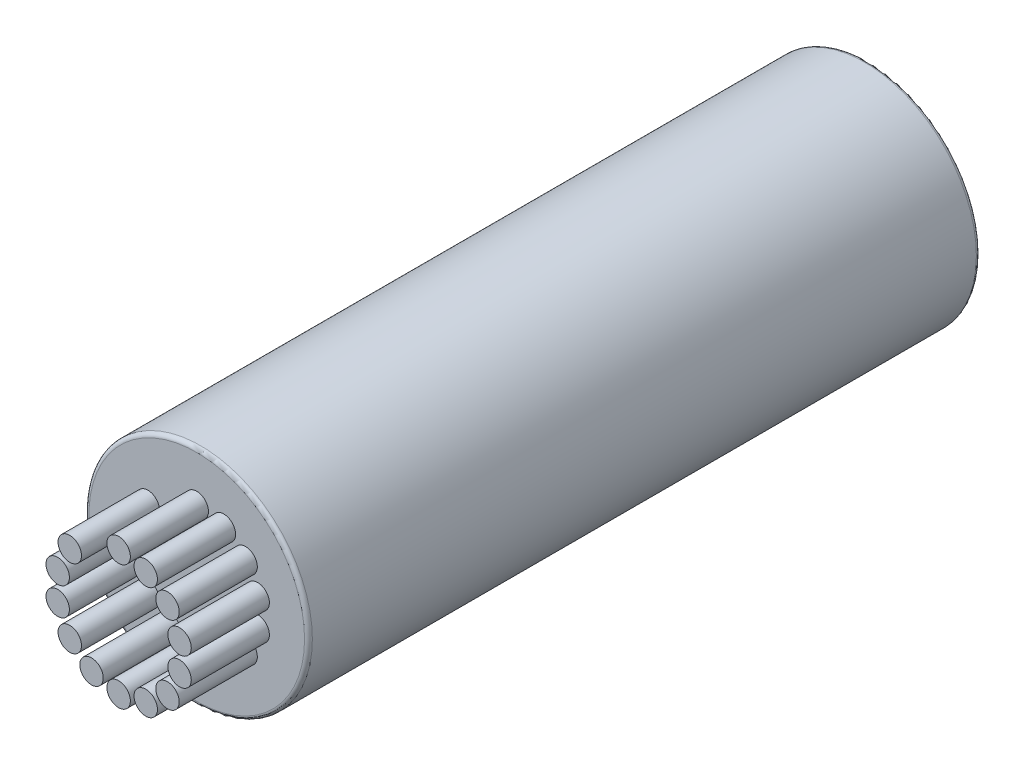
ISO-10303-21;
HEADER;
FILE_DESCRIPTION(('STEP AP214'),'2;1');
FILE_NAME('part.step','',(''),(''),'','','');
FILE_SCHEMA(('AUTOMOTIVE_DESIGN { 1 0 10303 214 1 1 1 1 }'));
ENDSEC;
DATA;
#1=APPLICATION_CONTEXT('core data for automotive mechanical design processes');
#2=APPLICATION_PROTOCOL_DEFINITION('international standard','automotive_design',2000,#1);
#3=PRODUCT_CONTEXT('',#1,'mechanical');
#4=PRODUCT('Part','Part','',(#3));
#5=PRODUCT_RELATED_PRODUCT_CATEGORY('part','',(#4));
#6=PRODUCT_DEFINITION_FORMATION('','',#4);
#7=PRODUCT_DEFINITION_CONTEXT('part definition',#1,'design');
#8=PRODUCT_DEFINITION('design','',#6,#7);
#9=PRODUCT_DEFINITION_SHAPE('','',#8);
#10=(LENGTH_UNIT() NAMED_UNIT(*) SI_UNIT(.MILLI.,.METRE.));
#11=(NAMED_UNIT(*) PLANE_ANGLE_UNIT() SI_UNIT($,.RADIAN.));
#12=(NAMED_UNIT(*) SI_UNIT($,.STERADIAN.) SOLID_ANGLE_UNIT());
#13=UNCERTAINTY_MEASURE_WITH_UNIT(LENGTH_MEASURE(1.E-05),#10,'distance_accuracy_value','');
#14=(GEOMETRIC_REPRESENTATION_CONTEXT(3) GLOBAL_UNCERTAINTY_ASSIGNED_CONTEXT((#13)) GLOBAL_UNIT_ASSIGNED_CONTEXT((#10,
#11,#12)) REPRESENTATION_CONTEXT('',''));
#15=CARTESIAN_POINT('',(0.,0.,0.));
#16=DIRECTION('',(0.,0.,1.));
#17=DIRECTION('',(1.,0.,0.));
#18=AXIS2_PLACEMENT_3D('',#15,#16,#17);
#19=CARTESIAN_POINT('',(0.,0.,43.));
#20=DIRECTION('',(0.,0.,-1.));
#21=DIRECTION('',(-1.,0.,0.));
#22=AXIS2_PLACEMENT_3D('',#19,#20,#21);
#23=CYLINDRICAL_SURFACE('',#22,7.15);
#24=CARTESIAN_POINT('',(0.,0.,42.75));
#25=DIRECTION('',(0.,0.,1.));
#26=DIRECTION('',(1.,0.,0.));
#27=AXIS2_PLACEMENT_3D('',#24,#25,#26);
#28=CIRCLE('',#27,7.15);
#29=CARTESIAN_POINT('',(7.15,0.,42.75));
#30=VERTEX_POINT('',#29);
#31=EDGE_CURVE('E39',#30,#30,#28,.F.);
#32=ORIENTED_EDGE('',*,*,#31,.T.);
#33=EDGE_LOOP('',(#32));
#34=FACE_BOUND('',#33,.T.);
#35=CARTESIAN_POINT('',(0.,0.,0.25));
#36=DIRECTION('',(0.,0.,1.));
#37=DIRECTION('',(1.,0.,0.));
#38=AXIS2_PLACEMENT_3D('',#35,#36,#37);
#39=CIRCLE('',#38,7.15);
#40=CARTESIAN_POINT('',(7.15,0.,0.25));
#41=VERTEX_POINT('',#40);
#42=EDGE_CURVE('E43',#41,#41,#39,.T.);
#43=ORIENTED_EDGE('',*,*,#42,.T.);
#44=EDGE_LOOP('',(#43));
#45=FACE_BOUND('',#44,.T.);
#46=ADVANCED_FACE('F32',(#34,#45),#23,.T.);
#47=CARTESIAN_POINT('',(0.,0.,43.));
#48=DIRECTION('',(0.,0.,1.));
#49=DIRECTION('',(1.,0.,0.));
#50=AXIS2_PLACEMENT_3D('',#47,#48,#49);
#51=PLANE('',#50);
#52=CARTESIAN_POINT('',(0.,0.,43.));
#53=DIRECTION('',(0.,0.,1.));
#54=DIRECTION('',(1.,0.,0.));
#55=AXIS2_PLACEMENT_3D('',#52,#53,#54);
#56=CIRCLE('',#55,6.9);
#57=CARTESIAN_POINT('',(6.9,0.,43.));
#58=VERTEX_POINT('',#57);
#59=EDGE_CURVE('E47',#58,#58,#56,.T.);
#60=ORIENTED_EDGE('',*,*,#59,.T.);
#61=EDGE_LOOP('',(#60));
#62=FACE_BOUND('',#61,.T.);
#63=CARTESIAN_POINT('',(-3.12732592987195,2.49395920743501,43.));
#64=DIRECTION('',(0.,0.,1.));
#65=DIRECTION('',(1.,0.,0.));
#66=AXIS2_PLACEMENT_3D('',#63,#64,#65);
#67=CIRCLE('',#66,0.750000000000115);
#68=CARTESIAN_POINT('',(-2.37732592987183,2.49395920743501,43.));
#69=VERTEX_POINT('',#68);
#70=EDGE_CURVE('E131',#69,#69,#67,.T.);
#71=ORIENTED_EDGE('',*,*,#70,.F.);
#72=EDGE_LOOP('',(#71));
#73=FACE_BOUND('',#72,.T.);
#74=CARTESIAN_POINT('',(-3.89971164872716,0.890083735825348,43.));
#75=DIRECTION('',(0.,0.,1.));
#76=DIRECTION('',(1.,0.,0.));
#77=AXIS2_PLACEMENT_3D('',#74,#75,#76);
#78=CIRCLE('',#77,0.750000000000158);
#79=CARTESIAN_POINT('',(-3.149711648727,0.890083735825348,43.));
#80=VERTEX_POINT('',#79);
#81=EDGE_CURVE('E125',#80,#80,#78,.T.);
#82=ORIENTED_EDGE('',*,*,#81,.F.);
#83=EDGE_LOOP('',(#82));
#84=FACE_BOUND('',#83,.T.);
#85=CARTESIAN_POINT('',(-3.8997116487272,-0.890083735825168,43.));
#86=DIRECTION('',(0.,0.,1.));
#87=DIRECTION('',(1.,0.,0.));
#88=AXIS2_PLACEMENT_3D('',#85,#86,#87);
#89=CIRCLE('',#88,0.750000000000203);
#90=CARTESIAN_POINT('',(-3.149711648727,-0.890083735825168,43.));
#91=VERTEX_POINT('',#90);
#92=EDGE_CURVE('E119',#91,#91,#89,.T.);
#93=ORIENTED_EDGE('',*,*,#92,.F.);
#94=EDGE_LOOP('',(#93));
#95=FACE_BOUND('',#94,.T.);
#96=CARTESIAN_POINT('',(-3.12732592987206,-2.49395920743486,43.));
#97=DIRECTION('',(0.,0.,1.));
#98=DIRECTION('',(1.,0.,0.));
#99=AXIS2_PLACEMENT_3D('',#96,#97,#98);
#100=CIRCLE('',#99,0.750000000000238);
#101=CARTESIAN_POINT('',(-2.37732592987182,-2.49395920743486,43.));
#102=VERTEX_POINT('',#101);
#103=EDGE_CURVE('E113',#102,#102,#100,.T.);
#104=ORIENTED_EDGE('',*,*,#103,.F.);
#105=EDGE_LOOP('',(#104));
#106=FACE_BOUND('',#105,.T.);
#107=CARTESIAN_POINT('',(-1.7355349564702,-3.60387547160964,43.));
#108=DIRECTION('',(0.,0.,1.));
#109=DIRECTION('',(1.,0.,0.));
#110=AXIS2_PLACEMENT_3D('',#107,#108,#109);
#111=CIRCLE('',#110,0.750000000000253);
#112=CARTESIAN_POINT('',(-0.985534956469948,-3.60387547160964,43.));
#113=VERTEX_POINT('',#112);
#114=EDGE_CURVE('E107',#113,#113,#111,.T.);
#115=ORIENTED_EDGE('',*,*,#114,.F.);
#116=EDGE_LOOP('',(#115));
#117=FACE_BOUND('',#116,.T.);
#118=CARTESIAN_POINT('',(0.,-4.,43.));
#119=DIRECTION('',(0.,0.,1.));
#120=DIRECTION('',(1.,0.,0.));
#121=AXIS2_PLACEMENT_3D('',#118,#119,#120);
#122=CIRCLE('',#121,0.750000000000246);
#123=CARTESIAN_POINT('',(0.750000000000268,-4.,43.));
#124=VERTEX_POINT('',#123);
#125=EDGE_CURVE('E101',#124,#124,#122,.T.);
#126=ORIENTED_EDGE('',*,*,#125,.F.);
#127=EDGE_LOOP('',(#126));
#128=FACE_BOUND('',#127,.T.);
#129=CARTESIAN_POINT('',(1.73553495647026,-3.60387547160972,43.));
#130=DIRECTION('',(0.,0.,1.));
#131=DIRECTION('',(1.,0.,0.));
#132=AXIS2_PLACEMENT_3D('',#129,#130,#131);
#133=CIRCLE('',#132,0.750000000000218);
#134=CARTESIAN_POINT('',(2.48553495647048,-3.60387547160972,43.));
#135=VERTEX_POINT('',#134);
#136=EDGE_CURVE('E95',#135,#135,#133,.T.);
#137=ORIENTED_EDGE('',*,*,#136,.F.);
#138=EDGE_LOOP('',(#137));
#139=FACE_BOUND('',#138,.T.);
#140=CARTESIAN_POINT('',(3.12732592987218,-2.49395920743501,43.));
#141=DIRECTION('',(0.,0.,1.));
#142=DIRECTION('',(1.,0.,0.));
#143=AXIS2_PLACEMENT_3D('',#140,#141,#142);
#144=CIRCLE('',#143,0.75000000000017);
#145=CARTESIAN_POINT('',(3.87732592987235,-2.49395920743501,43.));
#146=VERTEX_POINT('',#145);
#147=EDGE_CURVE('E89',#146,#146,#144,.T.);
#148=ORIENTED_EDGE('',*,*,#147,.F.);
#149=EDGE_LOOP('',(#148));
#150=FACE_BOUND('',#149,.T.);
#151=CARTESIAN_POINT('',(3.89971164872739,-0.890083735825348,43.));
#152=DIRECTION('',(0.,0.,1.));
#153=DIRECTION('',(1.,0.,0.));
#154=AXIS2_PLACEMENT_3D('',#151,#152,#153);
#155=CIRCLE('',#154,0.750000000000117);
#156=CARTESIAN_POINT('',(4.64971164872751,-0.890083735825348,43.));
#157=VERTEX_POINT('',#156);
#158=EDGE_CURVE('E83',#157,#157,#155,.T.);
#159=ORIENTED_EDGE('',*,*,#158,.F.);
#160=EDGE_LOOP('',(#159));
#161=FACE_BOUND('',#160,.T.);
#162=CARTESIAN_POINT('',(3.89971164872743,0.890083735825167,43.));
#163=DIRECTION('',(0.,0.,1.));
#164=DIRECTION('',(1.,0.,0.));
#165=AXIS2_PLACEMENT_3D('',#162,#163,#164);
#166=CIRCLE('',#165,0.750000000000064);
#167=CARTESIAN_POINT('',(4.64971164872749,0.890083735825167,43.));
#168=VERTEX_POINT('',#167);
#169=EDGE_CURVE('E77',#168,#168,#166,.T.);
#170=ORIENTED_EDGE('',*,*,#169,.F.);
#171=EDGE_LOOP('',(#170));
#172=FACE_BOUND('',#171,.T.);
#173=CARTESIAN_POINT('',(3.12732592987225,2.49395920743477,43.));
#174=DIRECTION('',(0.,0.,1.));
#175=DIRECTION('',(1.,0.,0.));
#176=AXIS2_PLACEMENT_3D('',#173,#174,#175);
#177=CIRCLE('',#176,0.75);
#178=CARTESIAN_POINT('',(3.87732592987225,2.49395920743477,43.));
#179=VERTEX_POINT('',#178);
#180=EDGE_CURVE('E71',#179,#179,#177,.T.);
#181=ORIENTED_EDGE('',*,*,#180,.F.);
#182=EDGE_LOOP('',(#181));
#183=FACE_BOUND('',#182,.T.);
#184=CARTESIAN_POINT('',(1.73553495647042,3.60387547160959,43.));
#185=DIRECTION('',(0.,0.,1.));
#186=DIRECTION('',(1.,0.,0.));
#187=AXIS2_PLACEMENT_3D('',#184,#185,#186);
#188=CIRCLE('',#187,0.75);
#189=CARTESIAN_POINT('',(2.48553495647042,3.60387547160959,43.));
#190=VERTEX_POINT('',#189);
#191=EDGE_CURVE('E65',#190,#190,#188,.T.);
#192=ORIENTED_EDGE('',*,*,#191,.F.);
#193=EDGE_LOOP('',(#192));
#194=FACE_BOUND('',#193,.T.);
#195=CARTESIAN_POINT('',(2.07662222155635E-13,4.,43.));
#196=DIRECTION('',(0.,0.,1.));
#197=DIRECTION('',(1.,0.,0.));
#198=AXIS2_PLACEMENT_3D('',#195,#196,#197);
#199=CIRCLE('',#198,0.75);
#200=CARTESIAN_POINT('',(0.750000000000208,4.,43.));
#201=VERTEX_POINT('',#200);
#202=EDGE_CURVE('E59',#201,#201,#199,.T.);
#203=ORIENTED_EDGE('',*,*,#202,.F.);
#204=EDGE_LOOP('',(#203));
#205=FACE_BOUND('',#204,.T.);
#206=ADVANCED_FACE('F146',(#62,#73,#84,#95,#106,#117,#128,#139,#150,#161,#172,#183,#194,#205),
#51,.T.);
#207=CARTESIAN_POINT('',(0.,0.,0.));
#208=DIRECTION('',(0.,0.,1.));
#209=DIRECTION('',(1.,0.,0.));
#210=AXIS2_PLACEMENT_3D('',#207,#208,#209);
#211=PLANE('',#210);
#212=CARTESIAN_POINT('',(0.,0.,0.));
#213=DIRECTION('',(0.,0.,1.));
#214=DIRECTION('',(1.,0.,0.));
#215=AXIS2_PLACEMENT_3D('',#212,#213,#214);
#216=CIRCLE('',#215,6.9);
#217=CARTESIAN_POINT('',(6.9,0.,0.));
#218=VERTEX_POINT('',#217);
#219=EDGE_CURVE('E10',#218,#218,#216,.F.);
#220=ORIENTED_EDGE('',*,*,#219,.T.);
#221=EDGE_LOOP('',(#220));
#222=FACE_BOUND('',#221,.T.);
#223=CARTESIAN_POINT('',(0.,0.,0.));
#224=DIRECTION('',(0.,0.,-1.));
#225=DIRECTION('',(-1.,0.,0.));
#226=AXIS2_PLACEMENT_3D('',#223,#224,#225);
#227=CIRCLE('',#226,5.);
#228=CARTESIAN_POINT('',(-5.,0.,0.));
#229=VERTEX_POINT('',#228);
#230=EDGE_CURVE('E53',#229,#229,#227,.T.);
#231=ORIENTED_EDGE('',*,*,#230,.F.);
#232=EDGE_LOOP('',(#231));
#233=FACE_BOUND('',#232,.T.);
#234=ADVANCED_FACE('F149',(#222,#233),#211,.F.);
#235=CARTESIAN_POINT('',(0.,0.,0.1));
#236=DIRECTION('',(0.,0.,-1.));
#237=DIRECTION('',(-1.,0.,0.));
#238=AXIS2_PLACEMENT_3D('',#235,#236,#237);
#239=CYLINDRICAL_SURFACE('',#238,5.);
#240=CARTESIAN_POINT('',(0.,0.,0.1));
#241=DIRECTION('',(0.,0.,-1.));
#242=DIRECTION('',(-1.,0.,0.));
#243=AXIS2_PLACEMENT_3D('',#240,#241,#242);
#244=CIRCLE('',#243,5.);
#245=CARTESIAN_POINT('',(-5.,0.,0.1));
#246=VERTEX_POINT('',#245);
#247=EDGE_CURVE('E52',#246,#246,#244,.T.);
#248=ORIENTED_EDGE('',*,*,#247,.F.);
#249=EDGE_LOOP('',(#248));
#250=FACE_BOUND('',#249,.T.);
#251=ORIENTED_EDGE('',*,*,#230,.T.);
#252=EDGE_LOOP('',(#251));
#253=FACE_BOUND('',#252,.T.);
#254=ADVANCED_FACE('F189',(#250,#253),#239,.F.);
#255=CARTESIAN_POINT('',(0.,0.,0.1));
#256=DIRECTION('',(0.,0.,-1.));
#257=DIRECTION('',(-1.,0.,0.));
#258=AXIS2_PLACEMENT_3D('',#255,#256,#257);
#259=PLANE('',#258);
#260=ORIENTED_EDGE('',*,*,#247,.T.);
#261=EDGE_LOOP('',(#260));
#262=FACE_BOUND('',#261,.T.);
#263=ADVANCED_FACE('F179',(#262),#259,.T.);
#264=CARTESIAN_POINT('',(2.07662222155635E-13,4.,48.));
#265=DIRECTION('',(0.,0.,-1.));
#266=DIRECTION('',(-1.,0.,0.));
#267=AXIS2_PLACEMENT_3D('',#264,#265,#266);
#268=CYLINDRICAL_SURFACE('',#267,0.75);
#269=CARTESIAN_POINT('',(2.07662222155635E-13,4.,48.));
#270=DIRECTION('',(0.,0.,1.));
#271=DIRECTION('',(1.,0.,0.));
#272=AXIS2_PLACEMENT_3D('',#269,#270,#271);
#273=CIRCLE('',#272,0.75);
#274=CARTESIAN_POINT('',(0.750000000000208,4.,48.));
#275=VERTEX_POINT('',#274);
#276=EDGE_CURVE('E56',#275,#275,#273,.T.);
#277=ORIENTED_EDGE('',*,*,#276,.F.);
#278=EDGE_LOOP('',(#277));
#279=FACE_BOUND('',#278,.T.);
#280=ORIENTED_EDGE('',*,*,#202,.T.);
#281=EDGE_LOOP('',(#280));
#282=FACE_BOUND('',#281,.T.);
#283=ADVANCED_FACE('F176',(#279,#282),#268,.T.);
#284=CARTESIAN_POINT('',(2.07662222155635E-13,4.,48.));
#285=DIRECTION('',(0.,0.,1.));
#286=DIRECTION('',(1.,0.,0.));
#287=AXIS2_PLACEMENT_3D('',#284,#285,#286);
#288=PLANE('',#287);
#289=ORIENTED_EDGE('',*,*,#276,.T.);
#290=EDGE_LOOP('',(#289));
#291=FACE_BOUND('',#290,.T.);
#292=ADVANCED_FACE('F178',(#291),#288,.T.);
#293=CARTESIAN_POINT('',(1.73553495647042,3.60387547160959,48.));
#294=DIRECTION('',(0.,0.,-1.));
#295=DIRECTION('',(-1.,0.,0.));
#296=AXIS2_PLACEMENT_3D('',#293,#294,#295);
#297=CYLINDRICAL_SURFACE('',#296,0.75);
#298=CARTESIAN_POINT('',(1.73553495647042,3.60387547160959,48.));
#299=DIRECTION('',(0.,0.,1.));
#300=DIRECTION('',(1.,0.,0.));
#301=AXIS2_PLACEMENT_3D('',#298,#299,#300);
#302=CIRCLE('',#301,0.75);
#303=CARTESIAN_POINT('',(2.48553495647042,3.60387547160959,48.));
#304=VERTEX_POINT('',#303);
#305=EDGE_CURVE('E62',#304,#304,#302,.T.);
#306=ORIENTED_EDGE('',*,*,#305,.F.);
#307=EDGE_LOOP('',(#306));
#308=FACE_BOUND('',#307,.T.);
#309=ORIENTED_EDGE('',*,*,#191,.T.);
#310=EDGE_LOOP('',(#309));
#311=FACE_BOUND('',#310,.T.);
#312=ADVANCED_FACE('F186',(#308,#311),#297,.T.);
#313=CARTESIAN_POINT('',(1.73553495647042,3.60387547160959,48.));
#314=DIRECTION('',(0.,0.,1.));
#315=DIRECTION('',(1.,0.,0.));
#316=AXIS2_PLACEMENT_3D('',#313,#314,#315);
#317=PLANE('',#316);
#318=ORIENTED_EDGE('',*,*,#305,.T.);
#319=EDGE_LOOP('',(#318));
#320=FACE_BOUND('',#319,.T.);
#321=ADVANCED_FACE('F291',(#320),#317,.T.);
#322=CARTESIAN_POINT('',(3.12732592987225,2.49395920743477,48.));
#323=DIRECTION('',(0.,0.,-1.));
#324=DIRECTION('',(-1.,0.,0.));
#325=AXIS2_PLACEMENT_3D('',#322,#323,#324);
#326=CYLINDRICAL_SURFACE('',#325,0.75);
#327=CARTESIAN_POINT('',(3.12732592987225,2.49395920743477,48.));
#328=DIRECTION('',(0.,0.,1.));
#329=DIRECTION('',(1.,0.,0.));
#330=AXIS2_PLACEMENT_3D('',#327,#328,#329);
#331=CIRCLE('',#330,0.75);
#332=CARTESIAN_POINT('',(3.87732592987225,2.49395920743477,48.));
#333=VERTEX_POINT('',#332);
#334=EDGE_CURVE('E68',#333,#333,#331,.T.);
#335=ORIENTED_EDGE('',*,*,#334,.F.);
#336=EDGE_LOOP('',(#335));
#337=FACE_BOUND('',#336,.T.);
#338=ORIENTED_EDGE('',*,*,#180,.T.);
#339=EDGE_LOOP('',(#338));
#340=FACE_BOUND('',#339,.T.);
#341=ADVANCED_FACE('F287',(#337,#340),#326,.T.);
#342=CARTESIAN_POINT('',(3.12732592987225,2.49395920743477,48.));
#343=DIRECTION('',(0.,0.,1.));
#344=DIRECTION('',(1.,0.,0.));
#345=AXIS2_PLACEMENT_3D('',#342,#343,#344);
#346=PLANE('',#345);
#347=ORIENTED_EDGE('',*,*,#334,.T.);
#348=EDGE_LOOP('',(#347));
#349=FACE_BOUND('',#348,.T.);
#350=ADVANCED_FACE('F283',(#349),#346,.T.);
#351=CARTESIAN_POINT('',(3.89971164872743,0.890083735825167,48.));
#352=DIRECTION('',(0.,0.,-1.));
#353=DIRECTION('',(-1.,0.,0.));
#354=AXIS2_PLACEMENT_3D('',#351,#352,#353);
#355=CYLINDRICAL_SURFACE('',#354,0.750000000000064);
#356=CARTESIAN_POINT('',(3.89971164872743,0.890083735825167,48.));
#357=DIRECTION('',(0.,0.,1.));
#358=DIRECTION('',(1.,0.,0.));
#359=AXIS2_PLACEMENT_3D('',#356,#357,#358);
#360=CIRCLE('',#359,0.750000000000064);
#361=CARTESIAN_POINT('',(4.64971164872749,0.890083735825167,48.));
#362=VERTEX_POINT('',#361);
#363=EDGE_CURVE('E74',#362,#362,#360,.T.);
#364=ORIENTED_EDGE('',*,*,#363,.F.);
#365=EDGE_LOOP('',(#364));
#366=FACE_BOUND('',#365,.T.);
#367=ORIENTED_EDGE('',*,*,#169,.T.);
#368=EDGE_LOOP('',(#367));
#369=FACE_BOUND('',#368,.T.);
#370=ADVANCED_FACE('F279',(#366,#369),#355,.T.);
#371=CARTESIAN_POINT('',(3.89971164872743,0.890083735825167,48.));
#372=DIRECTION('',(0.,0.,1.));
#373=DIRECTION('',(1.,0.,0.));
#374=AXIS2_PLACEMENT_3D('',#371,#372,#373);
#375=PLANE('',#374);
#376=ORIENTED_EDGE('',*,*,#363,.T.);
#377=EDGE_LOOP('',(#376));
#378=FACE_BOUND('',#377,.T.);
#379=ADVANCED_FACE('F275',(#378),#375,.T.);
#380=CARTESIAN_POINT('',(3.89971164872739,-0.890083735825348,48.));
#381=DIRECTION('',(0.,0.,-1.));
#382=DIRECTION('',(-1.,0.,0.));
#383=AXIS2_PLACEMENT_3D('',#380,#381,#382);
#384=CYLINDRICAL_SURFACE('',#383,0.750000000000117);
#385=CARTESIAN_POINT('',(3.89971164872739,-0.890083735825348,48.));
#386=DIRECTION('',(0.,0.,1.));
#387=DIRECTION('',(1.,0.,0.));
#388=AXIS2_PLACEMENT_3D('',#385,#386,#387);
#389=CIRCLE('',#388,0.750000000000117);
#390=CARTESIAN_POINT('',(4.64971164872751,-0.890083735825348,48.));
#391=VERTEX_POINT('',#390);
#392=EDGE_CURVE('E80',#391,#391,#389,.T.);
#393=ORIENTED_EDGE('',*,*,#392,.F.);
#394=EDGE_LOOP('',(#393));
#395=FACE_BOUND('',#394,.T.);
#396=ORIENTED_EDGE('',*,*,#158,.T.);
#397=EDGE_LOOP('',(#396));
#398=FACE_BOUND('',#397,.T.);
#399=ADVANCED_FACE('F271',(#395,#398),#384,.T.);
#400=CARTESIAN_POINT('',(3.89971164872739,-0.890083735825348,48.));
#401=DIRECTION('',(0.,0.,1.));
#402=DIRECTION('',(1.,0.,0.));
#403=AXIS2_PLACEMENT_3D('',#400,#401,#402);
#404=PLANE('',#403);
#405=ORIENTED_EDGE('',*,*,#392,.T.);
#406=EDGE_LOOP('',(#405));
#407=FACE_BOUND('',#406,.T.);
#408=ADVANCED_FACE('F267',(#407),#404,.T.);
#409=CARTESIAN_POINT('',(3.12732592987218,-2.49395920743501,48.));
#410=DIRECTION('',(0.,0.,-1.));
#411=DIRECTION('',(-1.,0.,0.));
#412=AXIS2_PLACEMENT_3D('',#409,#410,#411);
#413=CYLINDRICAL_SURFACE('',#412,0.75000000000017);
#414=CARTESIAN_POINT('',(3.12732592987218,-2.49395920743501,48.));
#415=DIRECTION('',(0.,0.,1.));
#416=DIRECTION('',(1.,0.,0.));
#417=AXIS2_PLACEMENT_3D('',#414,#415,#416);
#418=CIRCLE('',#417,0.75000000000017);
#419=CARTESIAN_POINT('',(3.87732592987235,-2.49395920743501,48.));
#420=VERTEX_POINT('',#419);
#421=EDGE_CURVE('E86',#420,#420,#418,.T.);
#422=ORIENTED_EDGE('',*,*,#421,.F.);
#423=EDGE_LOOP('',(#422));
#424=FACE_BOUND('',#423,.T.);
#425=ORIENTED_EDGE('',*,*,#147,.T.);
#426=EDGE_LOOP('',(#425));
#427=FACE_BOUND('',#426,.T.);
#428=ADVANCED_FACE('F263',(#424,#427),#413,.T.);
#429=CARTESIAN_POINT('',(3.12732592987218,-2.49395920743501,48.));
#430=DIRECTION('',(0.,0.,1.));
#431=DIRECTION('',(1.,0.,0.));
#432=AXIS2_PLACEMENT_3D('',#429,#430,#431);
#433=PLANE('',#432);
#434=ORIENTED_EDGE('',*,*,#421,.T.);
#435=EDGE_LOOP('',(#434));
#436=FACE_BOUND('',#435,.T.);
#437=ADVANCED_FACE('F259',(#436),#433,.T.);
#438=CARTESIAN_POINT('',(1.73553495647026,-3.60387547160972,48.));
#439=DIRECTION('',(0.,0.,-1.));
#440=DIRECTION('',(-1.,0.,0.));
#441=AXIS2_PLACEMENT_3D('',#438,#439,#440);
#442=CYLINDRICAL_SURFACE('',#441,0.750000000000218);
#443=CARTESIAN_POINT('',(1.73553495647026,-3.60387547160972,48.));
#444=DIRECTION('',(0.,0.,1.));
#445=DIRECTION('',(1.,0.,0.));
#446=AXIS2_PLACEMENT_3D('',#443,#444,#445);
#447=CIRCLE('',#446,0.750000000000218);
#448=CARTESIAN_POINT('',(2.48553495647048,-3.60387547160972,48.));
#449=VERTEX_POINT('',#448);
#450=EDGE_CURVE('E92',#449,#449,#447,.T.);
#451=ORIENTED_EDGE('',*,*,#450,.F.);
#452=EDGE_LOOP('',(#451));
#453=FACE_BOUND('',#452,.T.);
#454=ORIENTED_EDGE('',*,*,#136,.T.);
#455=EDGE_LOOP('',(#454));
#456=FACE_BOUND('',#455,.T.);
#457=ADVANCED_FACE('F255',(#453,#456),#442,.T.);
#458=CARTESIAN_POINT('',(1.73553495647026,-3.60387547160972,48.));
#459=DIRECTION('',(0.,0.,1.));
#460=DIRECTION('',(1.,0.,0.));
#461=AXIS2_PLACEMENT_3D('',#458,#459,#460);
#462=PLANE('',#461);
#463=ORIENTED_EDGE('',*,*,#450,.T.);
#464=EDGE_LOOP('',(#463));
#465=FACE_BOUND('',#464,.T.);
#466=ADVANCED_FACE('F251',(#465),#462,.T.);
#467=CARTESIAN_POINT('',(0.,-4.,48.));
#468=DIRECTION('',(0.,0.,-1.));
#469=DIRECTION('',(-1.,0.,0.));
#470=AXIS2_PLACEMENT_3D('',#467,#468,#469);
#471=CYLINDRICAL_SURFACE('',#470,0.750000000000246);
#472=CARTESIAN_POINT('',(0.,-4.,48.));
#473=DIRECTION('',(0.,0.,1.));
#474=DIRECTION('',(1.,0.,0.));
#475=AXIS2_PLACEMENT_3D('',#472,#473,#474);
#476=CIRCLE('',#475,0.750000000000246);
#477=CARTESIAN_POINT('',(0.750000000000268,-4.,48.));
#478=VERTEX_POINT('',#477);
#479=EDGE_CURVE('E98',#478,#478,#476,.T.);
#480=ORIENTED_EDGE('',*,*,#479,.F.);
#481=EDGE_LOOP('',(#480));
#482=FACE_BOUND('',#481,.T.);
#483=ORIENTED_EDGE('',*,*,#125,.T.);
#484=EDGE_LOOP('',(#483));
#485=FACE_BOUND('',#484,.T.);
#486=ADVANCED_FACE('F247',(#482,#485),#471,.T.);
#487=CARTESIAN_POINT('',(0.,-4.,48.));
#488=DIRECTION('',(0.,0.,1.));
#489=DIRECTION('',(1.,0.,0.));
#490=AXIS2_PLACEMENT_3D('',#487,#488,#489);
#491=PLANE('',#490);
#492=ORIENTED_EDGE('',*,*,#479,.T.);
#493=EDGE_LOOP('',(#492));
#494=FACE_BOUND('',#493,.T.);
#495=ADVANCED_FACE('F243',(#494),#491,.T.);
#496=CARTESIAN_POINT('',(-1.7355349564702,-3.60387547160964,48.));
#497=DIRECTION('',(0.,0.,-1.));
#498=DIRECTION('',(-1.,0.,0.));
#499=AXIS2_PLACEMENT_3D('',#496,#497,#498);
#500=CYLINDRICAL_SURFACE('',#499,0.750000000000253);
#501=CARTESIAN_POINT('',(-1.7355349564702,-3.60387547160964,48.));
#502=DIRECTION('',(0.,0.,1.));
#503=DIRECTION('',(1.,0.,0.));
#504=AXIS2_PLACEMENT_3D('',#501,#502,#503);
#505=CIRCLE('',#504,0.750000000000253);
#506=CARTESIAN_POINT('',(-0.985534956469948,-3.60387547160964,48.));
#507=VERTEX_POINT('',#506);
#508=EDGE_CURVE('E104',#507,#507,#505,.T.);
#509=ORIENTED_EDGE('',*,*,#508,.F.);
#510=EDGE_LOOP('',(#509));
#511=FACE_BOUND('',#510,.T.);
#512=ORIENTED_EDGE('',*,*,#114,.T.);
#513=EDGE_LOOP('',(#512));
#514=FACE_BOUND('',#513,.T.);
#515=ADVANCED_FACE('F239',(#511,#514),#500,.T.);
#516=CARTESIAN_POINT('',(-1.7355349564702,-3.60387547160964,48.));
#517=DIRECTION('',(0.,0.,1.));
#518=DIRECTION('',(1.,0.,0.));
#519=AXIS2_PLACEMENT_3D('',#516,#517,#518);
#520=PLANE('',#519);
#521=ORIENTED_EDGE('',*,*,#508,.T.);
#522=EDGE_LOOP('',(#521));
#523=FACE_BOUND('',#522,.T.);
#524=ADVANCED_FACE('F235',(#523),#520,.T.);
#525=CARTESIAN_POINT('',(-3.12732592987206,-2.49395920743486,48.));
#526=DIRECTION('',(0.,0.,-1.));
#527=DIRECTION('',(-1.,0.,0.));
#528=AXIS2_PLACEMENT_3D('',#525,#526,#527);
#529=CYLINDRICAL_SURFACE('',#528,0.750000000000238);
#530=CARTESIAN_POINT('',(-3.12732592987206,-2.49395920743486,48.));
#531=DIRECTION('',(0.,0.,1.));
#532=DIRECTION('',(1.,0.,0.));
#533=AXIS2_PLACEMENT_3D('',#530,#531,#532);
#534=CIRCLE('',#533,0.750000000000238);
#535=CARTESIAN_POINT('',(-2.37732592987182,-2.49395920743486,48.));
#536=VERTEX_POINT('',#535);
#537=EDGE_CURVE('E110',#536,#536,#534,.T.);
#538=ORIENTED_EDGE('',*,*,#537,.F.);
#539=EDGE_LOOP('',(#538));
#540=FACE_BOUND('',#539,.T.);
#541=ORIENTED_EDGE('',*,*,#103,.T.);
#542=EDGE_LOOP('',(#541));
#543=FACE_BOUND('',#542,.T.);
#544=ADVANCED_FACE('F231',(#540,#543),#529,.T.);
#545=CARTESIAN_POINT('',(-3.12732592987206,-2.49395920743486,48.));
#546=DIRECTION('',(0.,0.,1.));
#547=DIRECTION('',(1.,0.,0.));
#548=AXIS2_PLACEMENT_3D('',#545,#546,#547);
#549=PLANE('',#548);
#550=ORIENTED_EDGE('',*,*,#537,.T.);
#551=EDGE_LOOP('',(#550));
#552=FACE_BOUND('',#551,.T.);
#553=ADVANCED_FACE('F227',(#552),#549,.T.);
#554=CARTESIAN_POINT('',(-3.8997116487272,-0.890083735825168,48.));
#555=DIRECTION('',(0.,0.,-1.));
#556=DIRECTION('',(-1.,0.,0.));
#557=AXIS2_PLACEMENT_3D('',#554,#555,#556);
#558=CYLINDRICAL_SURFACE('',#557,0.750000000000203);
#559=CARTESIAN_POINT('',(-3.8997116487272,-0.890083735825168,48.));
#560=DIRECTION('',(0.,0.,1.));
#561=DIRECTION('',(1.,0.,0.));
#562=AXIS2_PLACEMENT_3D('',#559,#560,#561);
#563=CIRCLE('',#562,0.750000000000203);
#564=CARTESIAN_POINT('',(-3.149711648727,-0.890083735825168,48.));
#565=VERTEX_POINT('',#564);
#566=EDGE_CURVE('E116',#565,#565,#563,.T.);
#567=ORIENTED_EDGE('',*,*,#566,.F.);
#568=EDGE_LOOP('',(#567));
#569=FACE_BOUND('',#568,.T.);
#570=ORIENTED_EDGE('',*,*,#92,.T.);
#571=EDGE_LOOP('',(#570));
#572=FACE_BOUND('',#571,.T.);
#573=ADVANCED_FACE('F223',(#569,#572),#558,.T.);
#574=CARTESIAN_POINT('',(-3.8997116487272,-0.890083735825168,48.));
#575=DIRECTION('',(0.,0.,1.));
#576=DIRECTION('',(1.,0.,0.));
#577=AXIS2_PLACEMENT_3D('',#574,#575,#576);
#578=PLANE('',#577);
#579=ORIENTED_EDGE('',*,*,#566,.T.);
#580=EDGE_LOOP('',(#579));
#581=FACE_BOUND('',#580,.T.);
#582=ADVANCED_FACE('F219',(#581),#578,.T.);
#583=CARTESIAN_POINT('',(-3.89971164872716,0.890083735825348,48.));
#584=DIRECTION('',(0.,0.,-1.));
#585=DIRECTION('',(-1.,0.,0.));
#586=AXIS2_PLACEMENT_3D('',#583,#584,#585);
#587=CYLINDRICAL_SURFACE('',#586,0.750000000000158);
#588=CARTESIAN_POINT('',(-3.89971164872716,0.890083735825348,48.));
#589=DIRECTION('',(0.,0.,1.));
#590=DIRECTION('',(1.,0.,0.));
#591=AXIS2_PLACEMENT_3D('',#588,#589,#590);
#592=CIRCLE('',#591,0.750000000000158);
#593=CARTESIAN_POINT('',(-3.149711648727,0.890083735825348,48.));
#594=VERTEX_POINT('',#593);
#595=EDGE_CURVE('E122',#594,#594,#592,.T.);
#596=ORIENTED_EDGE('',*,*,#595,.F.);
#597=EDGE_LOOP('',(#596));
#598=FACE_BOUND('',#597,.T.);
#599=ORIENTED_EDGE('',*,*,#81,.T.);
#600=EDGE_LOOP('',(#599));
#601=FACE_BOUND('',#600,.T.);
#602=ADVANCED_FACE('F215',(#598,#601),#587,.T.);
#603=CARTESIAN_POINT('',(-3.89971164872716,0.890083735825348,48.));
#604=DIRECTION('',(0.,0.,1.));
#605=DIRECTION('',(1.,0.,0.));
#606=AXIS2_PLACEMENT_3D('',#603,#604,#605);
#607=PLANE('',#606);
#608=ORIENTED_EDGE('',*,*,#595,.T.);
#609=EDGE_LOOP('',(#608));
#610=FACE_BOUND('',#609,.T.);
#611=ADVANCED_FACE('F142',(#610),#607,.T.);
#612=CARTESIAN_POINT('',(-3.12732592987195,2.49395920743501,48.));
#613=DIRECTION('',(0.,0.,-1.));
#614=DIRECTION('',(-1.,0.,0.));
#615=AXIS2_PLACEMENT_3D('',#612,#613,#614);
#616=CYLINDRICAL_SURFACE('',#615,0.750000000000115);
#617=CARTESIAN_POINT('',(-3.12732592987195,2.49395920743501,48.));
#618=DIRECTION('',(0.,0.,1.));
#619=DIRECTION('',(1.,0.,0.));
#620=AXIS2_PLACEMENT_3D('',#617,#618,#619);
#621=CIRCLE('',#620,0.750000000000115);
#622=CARTESIAN_POINT('',(-2.37732592987183,2.49395920743501,48.));
#623=VERTEX_POINT('',#622);
#624=EDGE_CURVE('E128',#623,#623,#621,.T.);
#625=ORIENTED_EDGE('',*,*,#624,.F.);
#626=EDGE_LOOP('',(#625));
#627=FACE_BOUND('',#626,.T.);
#628=ORIENTED_EDGE('',*,*,#70,.T.);
#629=EDGE_LOOP('',(#628));
#630=FACE_BOUND('',#629,.T.);
#631=ADVANCED_FACE('F139',(#627,#630),#616,.T.);
#632=CARTESIAN_POINT('',(-3.12732592987195,2.49395920743501,48.));
#633=DIRECTION('',(0.,0.,1.));
#634=DIRECTION('',(1.,0.,0.));
#635=AXIS2_PLACEMENT_3D('',#632,#633,#634);
#636=PLANE('',#635);
#637=ORIENTED_EDGE('',*,*,#624,.T.);
#638=EDGE_LOOP('',(#637));
#639=FACE_BOUND('',#638,.T.);
#640=ADVANCED_FACE('F137',(#639),#636,.T.);
#641=CARTESIAN_POINT('',(0.,0.,42.75));
#642=DIRECTION('',(0.,0.,1.));
#643=DIRECTION('',(1.,0.,0.));
#644=AXIS2_PLACEMENT_3D('',#641,#642,#643);
#645=TOROIDAL_SURFACE('',#644,6.9,0.25);
#646=ORIENTED_EDGE('',*,*,#31,.F.);
#647=EDGE_LOOP('',(#646));
#648=FACE_BOUND('',#647,.T.);
#649=ORIENTED_EDGE('',*,*,#59,.F.);
#650=EDGE_LOOP('',(#649));
#651=FACE_BOUND('',#650,.T.);
#652=ADVANCED_FACE('F199',(#648,#651),#645,.T.);
#653=CARTESIAN_POINT('',(0.,0.,0.25));
#654=DIRECTION('',(0.,0.,1.));
#655=DIRECTION('',(1.,0.,0.));
#656=AXIS2_PLACEMENT_3D('',#653,#654,#655);
#657=TOROIDAL_SURFACE('',#656,6.9,0.25);
#658=ORIENTED_EDGE('',*,*,#219,.F.);
#659=EDGE_LOOP('',(#658));
#660=FACE_BOUND('',#659,.T.);
#661=ORIENTED_EDGE('',*,*,#42,.F.);
#662=EDGE_LOOP('',(#661));
#663=FACE_BOUND('',#662,.T.);
#664=ADVANCED_FACE('F34',(#660,#663),#657,.T.);
#665=CLOSED_SHELL('',(#46,#206,#234,#254,#263,#283,#292,#312,#321,#341,#350,#370,#379,#399,#408,
#428,#437,#457,#466,#486,#495,#515,#524,#544,#553,#573,#582,#602,#611,#631,#640,#652,#664));
#666=MANIFOLD_SOLID_BREP('B2',#665);
#667=ADVANCED_BREP_SHAPE_REPRESENTATION('',(#18,#666),#14);
#668=SHAPE_DEFINITION_REPRESENTATION(#9,#667);
ENDSEC;
END-ISO-10303-21;
